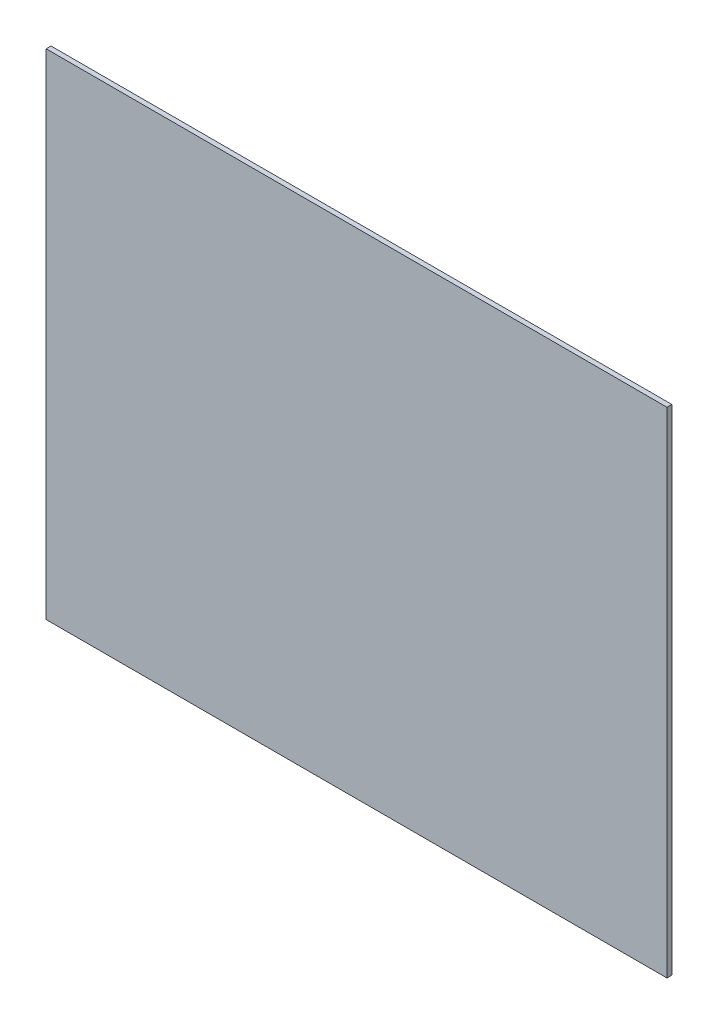
ISO-10303-21;
HEADER;
FILE_DESCRIPTION(('STEP AP214'),'2;1');
FILE_NAME('part.step','',(''),(''),'','','');
FILE_SCHEMA(('AUTOMOTIVE_DESIGN { 1 0 10303 214 1 1 1 1 }'));
ENDSEC;
DATA;
#1=APPLICATION_CONTEXT('core data for automotive mechanical design processes');
#2=APPLICATION_PROTOCOL_DEFINITION('international standard','automotive_design',2000,#1);
#3=PRODUCT_CONTEXT('',#1,'mechanical');
#4=PRODUCT('Part','Part','',(#3));
#5=PRODUCT_RELATED_PRODUCT_CATEGORY('part','',(#4));
#6=PRODUCT_DEFINITION_FORMATION('','',#4);
#7=PRODUCT_DEFINITION_CONTEXT('part definition',#1,'design');
#8=PRODUCT_DEFINITION('design','',#6,#7);
#9=PRODUCT_DEFINITION_SHAPE('','',#8);
#10=(LENGTH_UNIT() NAMED_UNIT(*) SI_UNIT(.MILLI.,.METRE.));
#11=(NAMED_UNIT(*) PLANE_ANGLE_UNIT() SI_UNIT($,.RADIAN.));
#12=(NAMED_UNIT(*) SI_UNIT($,.STERADIAN.) SOLID_ANGLE_UNIT());
#13=UNCERTAINTY_MEASURE_WITH_UNIT(LENGTH_MEASURE(1.E-05),#10,'distance_accuracy_value','');
#14=(GEOMETRIC_REPRESENTATION_CONTEXT(3) GLOBAL_UNCERTAINTY_ASSIGNED_CONTEXT((#13)) GLOBAL_UNIT_ASSIGNED_CONTEXT((#10,
#11,#12)) REPRESENTATION_CONTEXT('',''));
#15=CARTESIAN_POINT('',(0.,0.,0.));
#16=DIRECTION('',(0.,0.,1.));
#17=DIRECTION('',(1.,0.,0.));
#18=AXIS2_PLACEMENT_3D('',#15,#16,#17);
#19=CARTESIAN_POINT('',(416.,-331.25,6.5));
#20=DIRECTION('',(-1.,0.,0.));
#21=DIRECTION('',(0.,0.,1.));
#22=AXIS2_PLACEMENT_3D('',#19,#20,#21);
#23=PLANE('',#22);
#24=DIRECTION('',(0.,1.,0.));
#25=VECTOR('',#24,1.);
#26=CARTESIAN_POINT('',(416.,-331.25,0.));
#27=LINE('',#26,#25);
#28=CARTESIAN_POINT('',(416.,-331.25,0.));
#29=VERTEX_POINT('',#28);
#30=CARTESIAN_POINT('',(416.,331.25,0.));
#31=VERTEX_POINT('',#30);
#32=EDGE_CURVE('E96',#29,#31,#27,.T.);
#33=ORIENTED_EDGE('',*,*,#32,.T.);
#34=DIRECTION('',(0.,0.,-1.));
#35=VECTOR('',#34,1.);
#36=CARTESIAN_POINT('',(416.,331.25,6.5));
#37=LINE('',#36,#35);
#38=CARTESIAN_POINT('',(416.,331.25,6.5));
#39=VERTEX_POINT('',#38);
#40=EDGE_CURVE('E11',#39,#31,#37,.T.);
#41=ORIENTED_EDGE('',*,*,#40,.F.);
#42=DIRECTION('',(0.,1.,0.));
#43=VECTOR('',#42,1.);
#44=CARTESIAN_POINT('',(416.,-331.25,6.5));
#45=LINE('',#44,#43);
#46=CARTESIAN_POINT('',(416.,-331.25,6.5));
#47=VERTEX_POINT('',#46);
#48=EDGE_CURVE('E84',#47,#39,#45,.T.);
#49=ORIENTED_EDGE('',*,*,#48,.F.);
#50=DIRECTION('',(0.,0.,-1.));
#51=VECTOR('',#50,1.);
#52=CARTESIAN_POINT('',(416.,-331.25,6.5));
#53=LINE('',#52,#51);
#54=EDGE_CURVE('E92',#47,#29,#53,.T.);
#55=ORIENTED_EDGE('',*,*,#54,.T.);
#56=EDGE_LOOP('',(#33,#41,#49,#55));
#57=FACE_BOUND('',#56,.T.);
#58=ADVANCED_FACE('F33',(#57),#23,.F.);
#59=CARTESIAN_POINT('',(-416.,331.25,6.5));
#60=DIRECTION('',(0.,-1.,0.));
#61=DIRECTION('',(0.,0.,-1.));
#62=AXIS2_PLACEMENT_3D('',#59,#60,#61);
#63=PLANE('',#62);
#64=DIRECTION('',(-1.,0.,0.));
#65=VECTOR('',#64,1.);
#66=CARTESIAN_POINT('',(-416.,331.25,0.));
#67=LINE('',#66,#65);
#68=CARTESIAN_POINT('',(-416.,331.25,0.));
#69=VERTEX_POINT('',#68);
#70=EDGE_CURVE('E88',#31,#69,#67,.T.);
#71=ORIENTED_EDGE('',*,*,#70,.T.);
#72=DIRECTION('',(0.,0.,-1.));
#73=VECTOR('',#72,1.);
#74=CARTESIAN_POINT('',(-416.,331.25,6.5));
#75=LINE('',#74,#73);
#76=CARTESIAN_POINT('',(-416.,331.25,6.5));
#77=VERTEX_POINT('',#76);
#78=EDGE_CURVE('E41',#77,#69,#75,.T.);
#79=ORIENTED_EDGE('',*,*,#78,.F.);
#80=DIRECTION('',(-1.,0.,0.));
#81=VECTOR('',#80,1.);
#82=CARTESIAN_POINT('',(-416.,331.25,6.5));
#83=LINE('',#82,#81);
#84=EDGE_CURVE('E79',#39,#77,#83,.T.);
#85=ORIENTED_EDGE('',*,*,#84,.F.);
#86=ORIENTED_EDGE('',*,*,#40,.T.);
#87=EDGE_LOOP('',(#71,#79,#85,#86));
#88=FACE_BOUND('',#87,.T.);
#89=ADVANCED_FACE('F87',(#88),#63,.F.);
#90=CARTESIAN_POINT('',(-416.,-331.25,6.5));
#91=DIRECTION('',(1.,0.,0.));
#92=DIRECTION('',(0.,0.,-1.));
#93=AXIS2_PLACEMENT_3D('',#90,#91,#92);
#94=PLANE('',#93);
#95=DIRECTION('',(0.,-1.,0.));
#96=VECTOR('',#95,1.);
#97=CARTESIAN_POINT('',(-416.,-331.25,0.));
#98=LINE('',#97,#96);
#99=CARTESIAN_POINT('',(-416.,-331.25,0.));
#100=VERTEX_POINT('',#99);
#101=EDGE_CURVE('E66',#69,#100,#98,.T.);
#102=ORIENTED_EDGE('',*,*,#101,.T.);
#103=DIRECTION('',(0.,0.,-1.));
#104=VECTOR('',#103,1.);
#105=CARTESIAN_POINT('',(-416.,-331.25,6.5));
#106=LINE('',#105,#104);
#107=CARTESIAN_POINT('',(-416.,-331.25,6.5));
#108=VERTEX_POINT('',#107);
#109=EDGE_CURVE('E89',#108,#100,#106,.T.);
#110=ORIENTED_EDGE('',*,*,#109,.F.);
#111=DIRECTION('',(0.,-1.,0.));
#112=VECTOR('',#111,1.);
#113=CARTESIAN_POINT('',(-416.,-331.25,6.5));
#114=LINE('',#113,#112);
#115=EDGE_CURVE('E82',#77,#108,#114,.T.);
#116=ORIENTED_EDGE('',*,*,#115,.F.);
#117=ORIENTED_EDGE('',*,*,#78,.T.);
#118=EDGE_LOOP('',(#102,#110,#116,#117));
#119=FACE_BOUND('',#118,.T.);
#120=ADVANCED_FACE('F90',(#119),#94,.F.);
#121=CARTESIAN_POINT('',(-416.,-331.25,6.5));
#122=DIRECTION('',(0.,1.,0.));
#123=DIRECTION('',(0.,0.,1.));
#124=AXIS2_PLACEMENT_3D('',#121,#122,#123);
#125=PLANE('',#124);
#126=DIRECTION('',(1.,0.,0.));
#127=VECTOR('',#126,1.);
#128=CARTESIAN_POINT('',(-416.,-331.25,0.));
#129=LINE('',#128,#127);
#130=EDGE_CURVE('E72',#100,#29,#129,.T.);
#131=ORIENTED_EDGE('',*,*,#130,.T.);
#132=ORIENTED_EDGE('',*,*,#54,.F.);
#133=DIRECTION('',(1.,0.,0.));
#134=VECTOR('',#133,1.);
#135=CARTESIAN_POINT('',(-416.,-331.25,6.5));
#136=LINE('',#135,#134);
#137=EDGE_CURVE('E49',#108,#47,#136,.T.);
#138=ORIENTED_EDGE('',*,*,#137,.F.);
#139=ORIENTED_EDGE('',*,*,#109,.T.);
#140=EDGE_LOOP('',(#131,#132,#138,#139));
#141=FACE_BOUND('',#140,.T.);
#142=ADVANCED_FACE('F103',(#141),#125,.F.);
#143=CARTESIAN_POINT('',(0.,0.,6.5));
#144=DIRECTION('',(0.,0.,-1.));
#145=DIRECTION('',(-1.,0.,0.));
#146=AXIS2_PLACEMENT_3D('',#143,#144,#145);
#147=PLANE('',#146);
#148=ORIENTED_EDGE('',*,*,#48,.T.);
#149=ORIENTED_EDGE('',*,*,#84,.T.);
#150=ORIENTED_EDGE('',*,*,#115,.T.);
#151=ORIENTED_EDGE('',*,*,#137,.T.);
#152=EDGE_LOOP('',(#148,#149,#150,#151));
#153=FACE_BOUND('',#152,.T.);
#154=ADVANCED_FACE('F80',(#153),#147,.F.);
#155=CARTESIAN_POINT('',(0.,0.,0.));
#156=DIRECTION('',(0.,0.,-1.));
#157=DIRECTION('',(-1.,0.,0.));
#158=AXIS2_PLACEMENT_3D('',#155,#156,#157);
#159=PLANE('',#158);
#160=ORIENTED_EDGE('',*,*,#32,.F.);
#161=ORIENTED_EDGE('',*,*,#130,.F.);
#162=ORIENTED_EDGE('',*,*,#101,.F.);
#163=ORIENTED_EDGE('',*,*,#70,.F.);
#164=EDGE_LOOP('',(#160,#161,#162,#163));
#165=FACE_BOUND('',#164,.T.);
#166=ADVANCED_FACE('F106',(#165),#159,.T.);
#167=CLOSED_SHELL('',(#58,#89,#120,#142,#154,#166));
#168=MANIFOLD_SOLID_BREP('B2',#167);
#169=ADVANCED_BREP_SHAPE_REPRESENTATION('',(#18,#168),#14);
#170=SHAPE_DEFINITION_REPRESENTATION(#9,#169);
ENDSEC;
END-ISO-10303-21;
